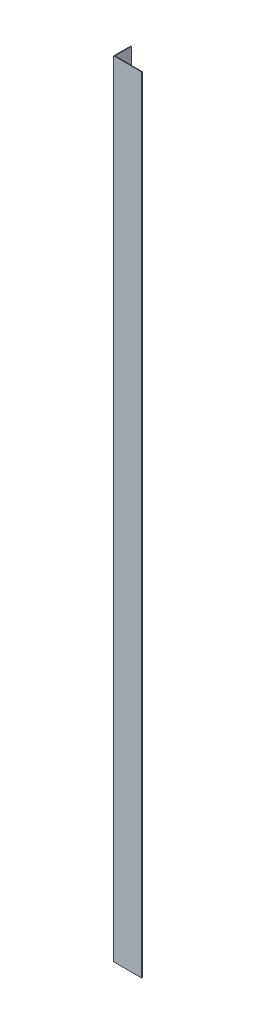
ISO-10303-21;
HEADER;
FILE_DESCRIPTION(('STEP AP214'),'2;1');
FILE_NAME('part.step','',(''),(''),'','','');
FILE_SCHEMA(('AUTOMOTIVE_DESIGN { 1 0 10303 214 1 1 1 1 }'));
ENDSEC;
DATA;
#1=APPLICATION_CONTEXT('core data for automotive mechanical design processes');
#2=APPLICATION_PROTOCOL_DEFINITION('international standard','automotive_design',2000,#1);
#3=PRODUCT_CONTEXT('',#1,'mechanical');
#4=PRODUCT('Part','Part','',(#3));
#5=PRODUCT_RELATED_PRODUCT_CATEGORY('part','',(#4));
#6=PRODUCT_DEFINITION_FORMATION('','',#4);
#7=PRODUCT_DEFINITION_CONTEXT('part definition',#1,'design');
#8=PRODUCT_DEFINITION('design','',#6,#7);
#9=PRODUCT_DEFINITION_SHAPE('','',#8);
#10=(LENGTH_UNIT() NAMED_UNIT(*) SI_UNIT(.MILLI.,.METRE.));
#11=(NAMED_UNIT(*) PLANE_ANGLE_UNIT() SI_UNIT($,.RADIAN.));
#12=(NAMED_UNIT(*) SI_UNIT($,.STERADIAN.) SOLID_ANGLE_UNIT());
#13=UNCERTAINTY_MEASURE_WITH_UNIT(LENGTH_MEASURE(1.E-05),#10,'distance_accuracy_value','');
#14=(GEOMETRIC_REPRESENTATION_CONTEXT(3) GLOBAL_UNCERTAINTY_ASSIGNED_CONTEXT((#13)) GLOBAL_UNIT_ASSIGNED_CONTEXT((#10,
#11,#12)) REPRESENTATION_CONTEXT('',''));
#15=CARTESIAN_POINT('',(0.,0.,0.));
#16=DIRECTION('',(0.,0.,1.));
#17=DIRECTION('',(1.,0.,0.));
#18=AXIS2_PLACEMENT_3D('',#15,#16,#17);
#19=CARTESIAN_POINT('',(1334.,1970.,40.));
#20=DIRECTION('',(0.,0.,-1.));
#21=DIRECTION('',(-1.,0.,0.));
#22=AXIS2_PLACEMENT_3D('',#19,#20,#21);
#23=PLANE('',#22);
#24=DIRECTION('',(1.,0.,0.));
#25=VECTOR('',#24,1.);
#26=CARTESIAN_POINT('',(1334.,120.,40.));
#27=LINE('',#26,#25);
#28=CARTESIAN_POINT('',(1334.,120.,40.));
#29=VERTEX_POINT('',#28);
#30=CARTESIAN_POINT('',(1400.,120.,40.));
#31=VERTEX_POINT('',#30);
#32=EDGE_CURVE('E123',#29,#31,#27,.T.);
#33=ORIENTED_EDGE('',*,*,#32,.T.);
#34=DIRECTION('',(0.,-1.,0.));
#35=VECTOR('',#34,1.);
#36=CARTESIAN_POINT('',(1400.,1970.,40.));
#37=LINE('',#36,#35);
#38=CARTESIAN_POINT('',(1400.,1970.,40.));
#39=VERTEX_POINT('',#38);
#40=EDGE_CURVE('E11',#39,#31,#37,.T.);
#41=ORIENTED_EDGE('',*,*,#40,.F.);
#42=DIRECTION('',(1.,0.,0.));
#43=VECTOR('',#42,1.);
#44=CARTESIAN_POINT('',(1334.,1970.,40.));
#45=LINE('',#44,#43);
#46=CARTESIAN_POINT('',(1334.,1970.,40.));
#47=VERTEX_POINT('',#46);
#48=EDGE_CURVE('E133',#47,#39,#45,.T.);
#49=ORIENTED_EDGE('',*,*,#48,.F.);
#50=DIRECTION('',(0.,-1.,0.));
#51=VECTOR('',#50,1.);
#52=CARTESIAN_POINT('',(1334.,1970.,40.));
#53=LINE('',#52,#51);
#54=EDGE_CURVE('E119',#47,#29,#53,.T.);
#55=ORIENTED_EDGE('',*,*,#54,.T.);
#56=EDGE_LOOP('',(#33,#41,#49,#55));
#57=FACE_BOUND('',#56,.T.);
#58=ADVANCED_FACE('F39',(#57),#23,.F.);
#59=CARTESIAN_POINT('',(1400.,1970.,40.));
#60=DIRECTION('',(-1.,0.,0.));
#61=DIRECTION('',(0.,0.,1.));
#62=AXIS2_PLACEMENT_3D('',#59,#60,#61);
#63=PLANE('',#62);
#64=DIRECTION('',(0.,0.,-1.));
#65=VECTOR('',#64,1.);
#66=CARTESIAN_POINT('',(1400.,120.,40.));
#67=LINE('',#66,#65);
#68=CARTESIAN_POINT('',(1400.,120.,38.5));
#69=VERTEX_POINT('',#68);
#70=EDGE_CURVE('E126',#31,#69,#67,.T.);
#71=ORIENTED_EDGE('',*,*,#70,.T.);
#72=DIRECTION('',(0.,-1.,0.));
#73=VECTOR('',#72,1.);
#74=CARTESIAN_POINT('',(1400.,1970.,38.5));
#75=LINE('',#74,#73);
#76=CARTESIAN_POINT('',(1400.,1970.,38.5));
#77=VERTEX_POINT('',#76);
#78=EDGE_CURVE('E47',#77,#69,#75,.T.);
#79=ORIENTED_EDGE('',*,*,#78,.F.);
#80=DIRECTION('',(0.,0.,-1.));
#81=VECTOR('',#80,1.);
#82=CARTESIAN_POINT('',(1400.,1970.,40.));
#83=LINE('',#82,#81);
#84=EDGE_CURVE('E92',#39,#77,#83,.T.);
#85=ORIENTED_EDGE('',*,*,#84,.F.);
#86=ORIENTED_EDGE('',*,*,#40,.T.);
#87=EDGE_LOOP('',(#71,#79,#85,#86));
#88=FACE_BOUND('',#87,.T.);
#89=ADVANCED_FACE('F157',(#88),#63,.F.);
#90=CARTESIAN_POINT('',(1400.,1970.,38.5));
#91=DIRECTION('',(0.,0.,1.));
#92=DIRECTION('',(1.,0.,0.));
#93=AXIS2_PLACEMENT_3D('',#90,#91,#92);
#94=PLANE('',#93);
#95=DIRECTION('',(-1.,0.,0.));
#96=VECTOR('',#95,1.);
#97=CARTESIAN_POINT('',(1400.,120.,38.5));
#98=LINE('',#97,#96);
#99=CARTESIAN_POINT('',(1335.5,120.,38.5));
#100=VERTEX_POINT('',#99);
#101=EDGE_CURVE('E128',#69,#100,#98,.T.);
#102=ORIENTED_EDGE('',*,*,#101,.T.);
#103=DIRECTION('',(0.,-1.,0.));
#104=VECTOR('',#103,1.);
#105=CARTESIAN_POINT('',(1335.5,1970.,38.5));
#106=LINE('',#105,#104);
#107=CARTESIAN_POINT('',(1335.5,1970.,38.5));
#108=VERTEX_POINT('',#107);
#109=EDGE_CURVE('E114',#108,#100,#106,.T.);
#110=ORIENTED_EDGE('',*,*,#109,.F.);
#111=DIRECTION('',(-1.,0.,0.));
#112=VECTOR('',#111,1.);
#113=CARTESIAN_POINT('',(1400.,1970.,38.5));
#114=LINE('',#113,#112);
#115=EDGE_CURVE('E105',#77,#108,#114,.T.);
#116=ORIENTED_EDGE('',*,*,#115,.F.);
#117=ORIENTED_EDGE('',*,*,#78,.T.);
#118=EDGE_LOOP('',(#102,#110,#116,#117));
#119=FACE_BOUND('',#118,.T.);
#120=ADVANCED_FACE('F139',(#119),#94,.F.);
#121=CARTESIAN_POINT('',(1335.5,1970.,38.5));
#122=DIRECTION('',(-1.,0.,0.));
#123=DIRECTION('',(0.,0.,1.));
#124=AXIS2_PLACEMENT_3D('',#121,#122,#123);
#125=PLANE('',#124);
#126=DIRECTION('',(0.,0.,-1.));
#127=VECTOR('',#126,1.);
#128=CARTESIAN_POINT('',(1335.5,120.,38.5));
#129=LINE('',#128,#127);
#130=CARTESIAN_POINT('',(1335.5,120.,0.));
#131=VERTEX_POINT('',#130);
#132=EDGE_CURVE('E113',#100,#131,#129,.T.);
#133=ORIENTED_EDGE('',*,*,#132,.T.);
#134=DIRECTION('',(0.,-1.,0.));
#135=VECTOR('',#134,1.);
#136=CARTESIAN_POINT('',(1335.5,1970.,0.));
#137=LINE('',#136,#135);
#138=CARTESIAN_POINT('',(1335.5,1970.,0.));
#139=VERTEX_POINT('',#138);
#140=EDGE_CURVE('E110',#139,#131,#137,.T.);
#141=ORIENTED_EDGE('',*,*,#140,.F.);
#142=DIRECTION('',(0.,0.,-1.));
#143=VECTOR('',#142,1.);
#144=CARTESIAN_POINT('',(1335.5,1970.,38.5));
#145=LINE('',#144,#143);
#146=EDGE_CURVE('E99',#108,#139,#145,.T.);
#147=ORIENTED_EDGE('',*,*,#146,.F.);
#148=ORIENTED_EDGE('',*,*,#109,.T.);
#149=EDGE_LOOP('',(#133,#141,#147,#148));
#150=FACE_BOUND('',#149,.T.);
#151=ADVANCED_FACE('F111',(#150),#125,.F.);
#152=CARTESIAN_POINT('',(1335.5,1970.,0.));
#153=DIRECTION('',(0.,0.,1.));
#154=DIRECTION('',(1.,0.,0.));
#155=AXIS2_PLACEMENT_3D('',#152,#153,#154);
#156=PLANE('',#155);
#157=DIRECTION('',(-1.,0.,0.));
#158=VECTOR('',#157,1.);
#159=CARTESIAN_POINT('',(1335.5,120.,0.));
#160=LINE('',#159,#158);
#161=CARTESIAN_POINT('',(1334.,120.,0.));
#162=VERTEX_POINT('',#161);
#163=EDGE_CURVE('E78',#131,#162,#160,.T.);
#164=ORIENTED_EDGE('',*,*,#163,.T.);
#165=DIRECTION('',(0.,-1.,0.));
#166=VECTOR('',#165,1.);
#167=CARTESIAN_POINT('',(1334.,1970.,0.));
#168=LINE('',#167,#166);
#169=CARTESIAN_POINT('',(1334.,1970.,0.));
#170=VERTEX_POINT('',#169);
#171=EDGE_CURVE('E115',#170,#162,#168,.T.);
#172=ORIENTED_EDGE('',*,*,#171,.F.);
#173=DIRECTION('',(-1.,0.,0.));
#174=VECTOR('',#173,1.);
#175=CARTESIAN_POINT('',(1335.5,1970.,0.));
#176=LINE('',#175,#174);
#177=EDGE_CURVE('E103',#139,#170,#176,.T.);
#178=ORIENTED_EDGE('',*,*,#177,.F.);
#179=ORIENTED_EDGE('',*,*,#140,.T.);
#180=EDGE_LOOP('',(#164,#172,#178,#179));
#181=FACE_BOUND('',#180,.T.);
#182=ADVANCED_FACE('F117',(#181),#156,.F.);
#183=CARTESIAN_POINT('',(1334.,1970.,0.));
#184=DIRECTION('',(1.,0.,0.));
#185=DIRECTION('',(0.,0.,-1.));
#186=AXIS2_PLACEMENT_3D('',#183,#184,#185);
#187=PLANE('',#186);
#188=DIRECTION('',(0.,0.,1.));
#189=VECTOR('',#188,1.);
#190=CARTESIAN_POINT('',(1334.,120.,0.));
#191=LINE('',#190,#189);
#192=EDGE_CURVE('E84',#162,#29,#191,.T.);
#193=ORIENTED_EDGE('',*,*,#192,.T.);
#194=ORIENTED_EDGE('',*,*,#54,.F.);
#195=DIRECTION('',(0.,0.,1.));
#196=VECTOR('',#195,1.);
#197=CARTESIAN_POINT('',(1334.,1970.,0.));
#198=LINE('',#197,#196);
#199=EDGE_CURVE('E55',#170,#47,#198,.T.);
#200=ORIENTED_EDGE('',*,*,#199,.F.);
#201=ORIENTED_EDGE('',*,*,#171,.T.);
#202=EDGE_LOOP('',(#193,#194,#200,#201));
#203=FACE_BOUND('',#202,.T.);
#204=ADVANCED_FACE('F146',(#203),#187,.F.);
#205=CARTESIAN_POINT('',(0.,1970.,0.));
#206=DIRECTION('',(0.,1.,0.));
#207=DIRECTION('',(0.,0.,1.));
#208=AXIS2_PLACEMENT_3D('',#205,#206,#207);
#209=PLANE('',#208);
#210=ORIENTED_EDGE('',*,*,#48,.T.);
#211=ORIENTED_EDGE('',*,*,#84,.T.);
#212=ORIENTED_EDGE('',*,*,#115,.T.);
#213=ORIENTED_EDGE('',*,*,#146,.T.);
#214=ORIENTED_EDGE('',*,*,#177,.T.);
#215=ORIENTED_EDGE('',*,*,#199,.T.);
#216=EDGE_LOOP('',(#210,#211,#212,#213,#214,#215));
#217=FACE_BOUND('',#216,.T.);
#218=ADVANCED_FACE('F101',(#217),#209,.T.);
#219=CARTESIAN_POINT('',(0.,120.,0.));
#220=DIRECTION('',(0.,1.,0.));
#221=DIRECTION('',(0.,0.,1.));
#222=AXIS2_PLACEMENT_3D('',#219,#220,#221);
#223=PLANE('',#222);
#224=ORIENTED_EDGE('',*,*,#32,.F.);
#225=ORIENTED_EDGE('',*,*,#192,.F.);
#226=ORIENTED_EDGE('',*,*,#163,.F.);
#227=ORIENTED_EDGE('',*,*,#132,.F.);
#228=ORIENTED_EDGE('',*,*,#101,.F.);
#229=ORIENTED_EDGE('',*,*,#70,.F.);
#230=EDGE_LOOP('',(#224,#225,#226,#227,#228,#229));
#231=FACE_BOUND('',#230,.T.);
#232=ADVANCED_FACE('F142',(#231),#223,.F.);
#233=CLOSED_SHELL('',(#58,#89,#120,#151,#182,#204,#218,#232));
#234=MANIFOLD_SOLID_BREP('B2',#233);
#235=ADVANCED_BREP_SHAPE_REPRESENTATION('',(#18,#234),#14);
#236=SHAPE_DEFINITION_REPRESENTATION(#9,#235);
ENDSEC;
END-ISO-10303-21;
